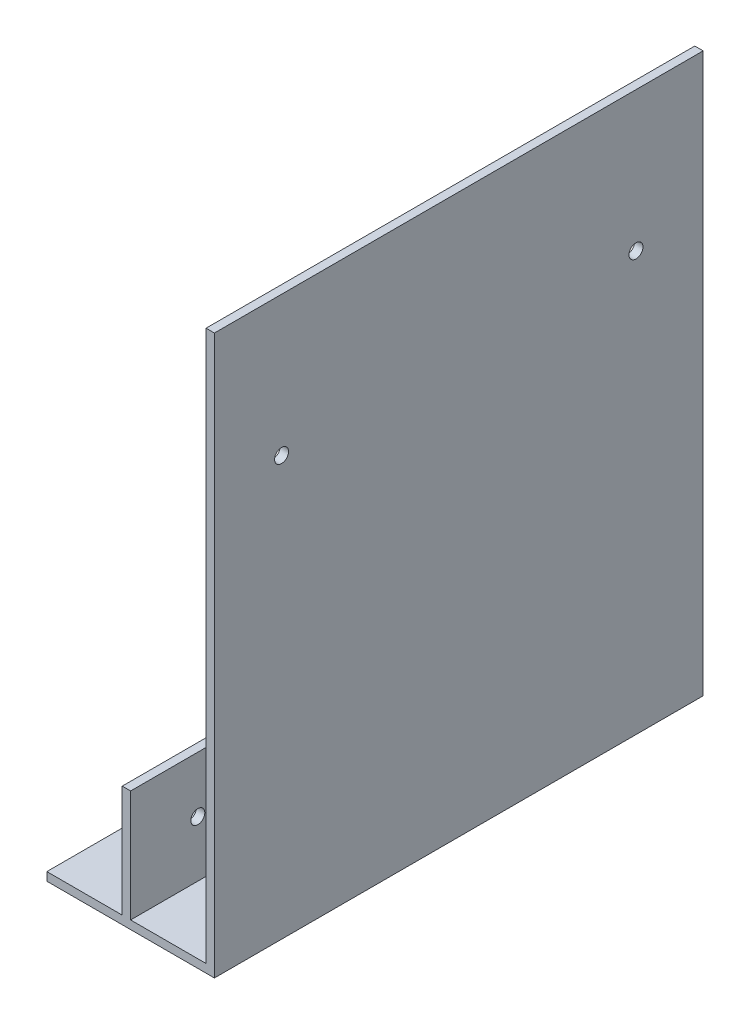
ISO-10303-21;
HEADER;
FILE_DESCRIPTION(('STEP AP214'),'2;1');
FILE_NAME('part.step','',(''),(''),'','','');
FILE_SCHEMA(('AUTOMOTIVE_DESIGN { 1 0 10303 214 1 1 1 1 }'));
ENDSEC;
DATA;
#1=APPLICATION_CONTEXT('core data for automotive mechanical design processes');
#2=APPLICATION_PROTOCOL_DEFINITION('international standard','automotive_design',2000,#1);
#3=PRODUCT_CONTEXT('',#1,'mechanical');
#4=PRODUCT('Part','Part','',(#3));
#5=PRODUCT_RELATED_PRODUCT_CATEGORY('part','',(#4));
#6=PRODUCT_DEFINITION_FORMATION('','',#4);
#7=PRODUCT_DEFINITION_CONTEXT('part definition',#1,'design');
#8=PRODUCT_DEFINITION('design','',#6,#7);
#9=PRODUCT_DEFINITION_SHAPE('','',#8);
#10=(LENGTH_UNIT() NAMED_UNIT(*) SI_UNIT(.MILLI.,.METRE.));
#11=(NAMED_UNIT(*) PLANE_ANGLE_UNIT() SI_UNIT($,.RADIAN.));
#12=(NAMED_UNIT(*) SI_UNIT($,.STERADIAN.) SOLID_ANGLE_UNIT());
#13=UNCERTAINTY_MEASURE_WITH_UNIT(LENGTH_MEASURE(1.E-05),#10,'distance_accuracy_value','');
#14=(GEOMETRIC_REPRESENTATION_CONTEXT(3) GLOBAL_UNCERTAINTY_ASSIGNED_CONTEXT((#13)) GLOBAL_UNIT_ASSIGNED_CONTEXT((#10,
#11,#12)) REPRESENTATION_CONTEXT('',''));
#15=CARTESIAN_POINT('',(0.,0.,0.));
#16=DIRECTION('',(0.,0.,1.));
#17=DIRECTION('',(1.,0.,0.));
#18=AXIS2_PLACEMENT_3D('',#15,#16,#17);
#19=CARTESIAN_POINT('',(3.,58.9769845057487,350.));
#20=DIRECTION('',(0.,-1.,0.));
#21=DIRECTION('',(0.,0.,-1.));
#22=AXIS2_PLACEMENT_3D('',#19,#20,#21);
#23=PLANE('',#22);
#24=DIRECTION('',(-1.,0.,0.));
#25=VECTOR('',#24,1.);
#26=CARTESIAN_POINT('',(3.,58.9769845057487,0.));
#27=LINE('',#26,#25);
#28=CARTESIAN_POINT('',(3.,58.9769845057487,0.));
#29=VERTEX_POINT('',#28);
#30=CARTESIAN_POINT('',(-3.,58.9769845057487,0.));
#31=VERTEX_POINT('',#30);
#32=EDGE_CURVE('E145',#29,#31,#27,.T.);
#33=ORIENTED_EDGE('',*,*,#32,.T.);
#34=DIRECTION('',(0.,0.,-1.));
#35=VECTOR('',#34,1.);
#36=CARTESIAN_POINT('',(-3.,58.9769845057487,350.));
#37=LINE('',#36,#35);
#38=CARTESIAN_POINT('',(-3.,58.9769845057487,350.));
#39=VERTEX_POINT('',#38);
#40=EDGE_CURVE('E11',#39,#31,#37,.T.);
#41=ORIENTED_EDGE('',*,*,#40,.F.);
#42=DIRECTION('',(-1.,0.,0.));
#43=VECTOR('',#42,1.);
#44=CARTESIAN_POINT('',(3.,58.9769845057487,350.));
#45=LINE('',#44,#43);
#46=CARTESIAN_POINT('',(3.,58.9769845057487,350.));
#47=VERTEX_POINT('',#46);
#48=EDGE_CURVE('E165',#47,#39,#45,.T.);
#49=ORIENTED_EDGE('',*,*,#48,.F.);
#50=DIRECTION('',(0.,0.,-1.));
#51=VECTOR('',#50,1.);
#52=CARTESIAN_POINT('',(3.,58.9769845057487,350.));
#53=LINE('',#52,#51);
#54=EDGE_CURVE('E141',#47,#29,#53,.T.);
#55=ORIENTED_EDGE('',*,*,#54,.T.);
#56=EDGE_LOOP('',(#33,#41,#49,#55));
#57=FACE_BOUND('',#56,.T.);
#58=ADVANCED_FACE('F35',(#57),#23,.F.);
#59=CARTESIAN_POINT('',(-3.,58.9769845057487,350.));
#60=DIRECTION('',(1.,0.,0.));
#61=DIRECTION('',(0.,1.,0.));
#62=AXIS2_PLACEMENT_3D('',#59,#60,#61);
#63=PLANE('',#62);
#64=CARTESIAN_POINT('',(-3.00000000000001,18.9769845057487,48.1041099646051));
#65=DIRECTION('',(1.,0.,0.));
#66=DIRECTION('',(0.,1.,0.));
#67=AXIS2_PLACEMENT_3D('',#64,#65,#66);
#68=CIRCLE('',#67,4.99999999999999);
#69=CARTESIAN_POINT('',(-3.00000000000001,23.9769845057487,48.1041099646051));
#70=VERTEX_POINT('',#69);
#71=EDGE_CURVE('E307',#70,#70,#68,.T.);
#72=ORIENTED_EDGE('',*,*,#71,.T.);
#73=EDGE_LOOP('',(#72));
#74=FACE_BOUND('',#73,.T.);
#75=CARTESIAN_POINT('',(-3.00000000000001,18.9769845057487,301.895890035395));
#76=DIRECTION('',(1.,0.,0.));
#77=DIRECTION('',(0.,1.,0.));
#78=AXIS2_PLACEMENT_3D('',#75,#76,#77);
#79=CIRCLE('',#78,4.99999999999999);
#80=CARTESIAN_POINT('',(-3.00000000000001,23.9769845057487,301.895890035395));
#81=VERTEX_POINT('',#80);
#82=EDGE_CURVE('E304',#81,#81,#79,.T.);
#83=ORIENTED_EDGE('',*,*,#82,.T.);
#84=EDGE_LOOP('',(#83));
#85=FACE_BOUND('',#84,.T.);
#86=CARTESIAN_POINT('',(-3.00000000000001,18.9769845057487,175.));
#87=DIRECTION('',(1.,0.,0.));
#88=DIRECTION('',(0.,1.,0.));
#89=AXIS2_PLACEMENT_3D('',#86,#87,#88);
#90=CIRCLE('',#89,11.);
#91=CARTESIAN_POINT('',(-3.00000000000001,29.9769845057487,175.));
#92=VERTEX_POINT('',#91);
#93=EDGE_CURVE('E301',#92,#92,#90,.T.);
#94=ORIENTED_EDGE('',*,*,#93,.T.);
#95=EDGE_LOOP('',(#94));
#96=FACE_BOUND('',#95,.T.);
#97=DIRECTION('',(0.,-1.,0.));
#98=VECTOR('',#97,1.);
#99=CARTESIAN_POINT('',(-3.,58.9769845057487,0.));
#100=LINE('',#99,#98);
#101=CARTESIAN_POINT('',(-3.00000000000001,-21.0230154942513,0.));
#102=VERTEX_POINT('',#101);
#103=EDGE_CURVE('E148',#31,#102,#100,.T.);
#104=ORIENTED_EDGE('',*,*,#103,.T.);
#105=DIRECTION('',(0.,0.,-1.));
#106=VECTOR('',#105,1.);
#107=CARTESIAN_POINT('',(-3.00000000000001,-21.0230154942513,350.));
#108=LINE('',#107,#106);
#109=CARTESIAN_POINT('',(-3.00000000000001,-21.0230154942513,350.));
#110=VERTEX_POINT('',#109);
#111=EDGE_CURVE('E44',#110,#102,#108,.T.);
#112=ORIENTED_EDGE('',*,*,#111,.F.);
#113=DIRECTION('',(0.,-1.,0.));
#114=VECTOR('',#113,1.);
#115=CARTESIAN_POINT('',(-3.,58.9769845057487,350.));
#116=LINE('',#115,#114);
#117=EDGE_CURVE('E102',#39,#110,#116,.T.);
#118=ORIENTED_EDGE('',*,*,#117,.F.);
#119=ORIENTED_EDGE('',*,*,#40,.T.);
#120=EDGE_LOOP('',(#104,#112,#118,#119));
#121=FACE_BOUND('',#120,.T.);
#122=ADVANCED_FACE('F246',(#74,#85,#96,#121),#63,.F.);
#123=CARTESIAN_POINT('',(-3.00000000000001,-21.0230154942513,350.));
#124=DIRECTION('',(0.,-1.,0.));
#125=DIRECTION('',(1.,0.,0.));
#126=AXIS2_PLACEMENT_3D('',#123,#124,#125);
#127=PLANE('',#126);
#128=CARTESIAN_POINT('',(-30.,-21.0230154942513,200.));
#129=DIRECTION('',(0.,-1.,0.));
#130=DIRECTION('',(1.,0.,0.));
#131=AXIS2_PLACEMENT_3D('',#128,#129,#130);
#132=CIRCLE('',#131,3.);
#133=CARTESIAN_POINT('',(-27.,-21.0230154942513,200.));
#134=VERTEX_POINT('',#133);
#135=EDGE_CURVE('E149',#134,#134,#132,.F.);
#136=ORIENTED_EDGE('',*,*,#135,.F.);
#137=EDGE_LOOP('',(#136));
#138=FACE_BOUND('',#137,.T.);
#139=CARTESIAN_POINT('',(-30.,-21.0230154942513,150.));
#140=DIRECTION('',(0.,-1.,0.));
#141=DIRECTION('',(1.,0.,0.));
#142=AXIS2_PLACEMENT_3D('',#139,#140,#141);
#143=CIRCLE('',#142,3.);
#144=CARTESIAN_POINT('',(-27.,-21.0230154942513,150.));
#145=VERTEX_POINT('',#144);
#146=EDGE_CURVE('E188',#145,#145,#143,.F.);
#147=ORIENTED_EDGE('',*,*,#146,.F.);
#148=EDGE_LOOP('',(#147));
#149=FACE_BOUND('',#148,.T.);
#150=DIRECTION('',(-1.,0.,0.));
#151=VECTOR('',#150,1.);
#152=CARTESIAN_POINT('',(-3.00000000000001,-21.0230154942513,0.));
#153=LINE('',#152,#151);
#154=CARTESIAN_POINT('',(-57.,-21.0230154942513,0.));
#155=VERTEX_POINT('',#154);
#156=EDGE_CURVE('E151',#102,#155,#153,.T.);
#157=ORIENTED_EDGE('',*,*,#156,.T.);
#158=DIRECTION('',(0.,0.,-1.));
#159=VECTOR('',#158,1.);
#160=CARTESIAN_POINT('',(-57.,-21.0230154942513,350.));
#161=LINE('',#160,#159);
#162=CARTESIAN_POINT('',(-57.,-21.0230154942513,350.));
#163=VERTEX_POINT('',#162);
#164=EDGE_CURVE('E178',#163,#155,#161,.T.);
#165=ORIENTED_EDGE('',*,*,#164,.F.);
#166=DIRECTION('',(-1.,0.,0.));
#167=VECTOR('',#166,1.);
#168=CARTESIAN_POINT('',(-3.00000000000001,-21.0230154942513,350.));
#169=LINE('',#168,#167);
#170=EDGE_CURVE('E207',#110,#163,#169,.T.);
#171=ORIENTED_EDGE('',*,*,#170,.F.);
#172=ORIENTED_EDGE('',*,*,#111,.T.);
#173=EDGE_LOOP('',(#157,#165,#171,#172));
#174=FACE_BOUND('',#173,.T.);
#175=ADVANCED_FACE('F250',(#138,#149,#174),#127,.F.);
#176=CARTESIAN_POINT('',(-57.,-21.0230154942513,350.));
#177=DIRECTION('',(1.,0.,0.));
#178=DIRECTION('',(0.,1.,0.));
#179=AXIS2_PLACEMENT_3D('',#176,#177,#178);
#180=PLANE('',#179);
#181=DIRECTION('',(0.,-1.,0.));
#182=VECTOR('',#181,1.);
#183=CARTESIAN_POINT('',(-57.,-21.0230154942513,0.));
#184=LINE('',#183,#182);
#185=CARTESIAN_POINT('',(-57.,-27.0230154942513,0.));
#186=VERTEX_POINT('',#185);
#187=EDGE_CURVE('E153',#155,#186,#184,.T.);
#188=ORIENTED_EDGE('',*,*,#187,.T.);
#189=DIRECTION('',(0.,0.,-1.));
#190=VECTOR('',#189,1.);
#191=CARTESIAN_POINT('',(-57.,-27.0230154942513,350.));
#192=LINE('',#191,#190);
#193=CARTESIAN_POINT('',(-57.,-27.0230154942513,350.));
#194=VERTEX_POINT('',#193);
#195=EDGE_CURVE('E175',#194,#186,#192,.T.);
#196=ORIENTED_EDGE('',*,*,#195,.F.);
#197=DIRECTION('',(0.,-1.,0.));
#198=VECTOR('',#197,1.);
#199=CARTESIAN_POINT('',(-57.,-21.0230154942513,350.));
#200=LINE('',#199,#198);
#201=EDGE_CURVE('E209',#163,#194,#200,.T.);
#202=ORIENTED_EDGE('',*,*,#201,.F.);
#203=ORIENTED_EDGE('',*,*,#164,.T.);
#204=EDGE_LOOP('',(#188,#196,#202,#203));
#205=FACE_BOUND('',#204,.T.);
#206=ADVANCED_FACE('F255',(#205),#180,.F.);
#207=CARTESIAN_POINT('',(57.,-27.0230154942513,350.));
#208=DIRECTION('',(0.,1.,0.));
#209=DIRECTION('',(0.,0.,1.));
#210=AXIS2_PLACEMENT_3D('',#207,#208,#209);
#211=PLANE('',#210);
#212=CARTESIAN_POINT('',(30.,-27.0230154942513,150.));
#213=DIRECTION('',(0.,1.,0.));
#214=DIRECTION('',(0.,0.,-1.));
#215=AXIS2_PLACEMENT_3D('',#212,#213,#214);
#216=CIRCLE('',#215,3.);
#217=CARTESIAN_POINT('',(30.,-27.0230154942513,147.));
#218=VERTEX_POINT('',#217);
#219=EDGE_CURVE('E199',#218,#218,#216,.T.);
#220=ORIENTED_EDGE('',*,*,#219,.T.);
#221=EDGE_LOOP('',(#220));
#222=FACE_BOUND('',#221,.T.);
#223=CARTESIAN_POINT('',(30.,-27.0230154942513,200.));
#224=DIRECTION('',(0.,1.,0.));
#225=DIRECTION('',(0.,0.,1.));
#226=AXIS2_PLACEMENT_3D('',#223,#224,#225);
#227=CIRCLE('',#226,3.);
#228=CARTESIAN_POINT('',(30.,-27.0230154942513,203.));
#229=VERTEX_POINT('',#228);
#230=EDGE_CURVE('E195',#229,#229,#227,.T.);
#231=ORIENTED_EDGE('',*,*,#230,.T.);
#232=EDGE_LOOP('',(#231));
#233=FACE_BOUND('',#232,.T.);
#234=CARTESIAN_POINT('',(-30.,-27.0230154942513,200.));
#235=DIRECTION('',(0.,1.,0.));
#236=DIRECTION('',(0.,0.,-1.));
#237=AXIS2_PLACEMENT_3D('',#234,#235,#236);
#238=CIRCLE('',#237,3.);
#239=CARTESIAN_POINT('',(-30.,-27.0230154942513,197.));
#240=VERTEX_POINT('',#239);
#241=EDGE_CURVE('E190',#240,#240,#238,.T.);
#242=ORIENTED_EDGE('',*,*,#241,.T.);
#243=EDGE_LOOP('',(#242));
#244=FACE_BOUND('',#243,.T.);
#245=CARTESIAN_POINT('',(-30.,-27.0230154942513,150.));
#246=DIRECTION('',(0.,1.,0.));
#247=DIRECTION('',(0.,0.,1.));
#248=AXIS2_PLACEMENT_3D('',#245,#246,#247);
#249=CIRCLE('',#248,3.);
#250=CARTESIAN_POINT('',(-30.,-27.0230154942513,153.));
#251=VERTEX_POINT('',#250);
#252=EDGE_CURVE('E184',#251,#251,#249,.T.);
#253=ORIENTED_EDGE('',*,*,#252,.T.);
#254=EDGE_LOOP('',(#253));
#255=FACE_BOUND('',#254,.T.);
#256=DIRECTION('',(1.,0.,0.));
#257=VECTOR('',#256,1.);
#258=CARTESIAN_POINT('',(57.,-27.0230154942513,0.));
#259=LINE('',#258,#257);
#260=CARTESIAN_POINT('',(63.,-27.0230154942513,0.));
#261=VERTEX_POINT('',#260);
#262=EDGE_CURVE('E156',#186,#261,#259,.T.);
#263=ORIENTED_EDGE('',*,*,#262,.T.);
#264=DIRECTION('',(0.,0.,-1.));
#265=VECTOR('',#264,1.);
#266=CARTESIAN_POINT('',(63.,-27.0230154942513,350.));
#267=LINE('',#266,#265);
#268=CARTESIAN_POINT('',(63.,-27.0230154942513,350.));
#269=VERTEX_POINT('',#268);
#270=EDGE_CURVE('E172',#269,#261,#267,.T.);
#271=ORIENTED_EDGE('',*,*,#270,.F.);
#272=DIRECTION('',(1.,0.,0.));
#273=VECTOR('',#272,1.);
#274=CARTESIAN_POINT('',(57.,-27.0230154942513,350.));
#275=LINE('',#274,#273);
#276=EDGE_CURVE('E211',#194,#269,#275,.T.);
#277=ORIENTED_EDGE('',*,*,#276,.F.);
#278=ORIENTED_EDGE('',*,*,#195,.T.);
#279=EDGE_LOOP('',(#263,#271,#277,#278));
#280=FACE_BOUND('',#279,.T.);
#281=ADVANCED_FACE('F263',(#222,#233,#244,#255,#280),#211,.F.);
#282=CARTESIAN_POINT('',(63.,372.976984505749,350.));
#283=DIRECTION('',(-1.,0.,0.));
#284=DIRECTION('',(0.,-1.,0.));
#285=AXIS2_PLACEMENT_3D('',#282,#283,#284);
#286=PLANE('',#285);
#287=CARTESIAN_POINT('',(63.,272.976984505749,48.1));
#288=DIRECTION('',(-1.,0.,0.));
#289=DIRECTION('',(0.,0.,1.));
#290=AXIS2_PLACEMENT_3D('',#287,#288,#289);
#291=CIRCLE('',#290,5.00000000000001);
#292=CARTESIAN_POINT('',(63.,272.976984505749,53.1));
#293=VERTEX_POINT('',#292);
#294=EDGE_CURVE('E298',#293,#293,#291,.T.);
#295=ORIENTED_EDGE('',*,*,#294,.T.);
#296=EDGE_LOOP('',(#295));
#297=FACE_BOUND('',#296,.T.);
#298=CARTESIAN_POINT('',(63.,272.976984505749,301.9));
#299=DIRECTION('',(-1.,0.,0.));
#300=DIRECTION('',(0.,0.,-1.));
#301=AXIS2_PLACEMENT_3D('',#298,#299,#300);
#302=CIRCLE('',#301,4.99999999999999);
#303=CARTESIAN_POINT('',(63.,272.976984505749,296.9));
#304=VERTEX_POINT('',#303);
#305=EDGE_CURVE('E285',#304,#304,#302,.T.);
#306=ORIENTED_EDGE('',*,*,#305,.T.);
#307=EDGE_LOOP('',(#306));
#308=FACE_BOUND('',#307,.T.);
#309=DIRECTION('',(0.,1.,0.));
#310=VECTOR('',#309,1.);
#311=CARTESIAN_POINT('',(63.,372.976984505749,0.));
#312=LINE('',#311,#310);
#313=CARTESIAN_POINT('',(63.,372.976984505749,0.));
#314=VERTEX_POINT('',#313);
#315=EDGE_CURVE('E158',#261,#314,#312,.T.);
#316=ORIENTED_EDGE('',*,*,#315,.T.);
#317=DIRECTION('',(0.,0.,-1.));
#318=VECTOR('',#317,1.);
#319=CARTESIAN_POINT('',(63.,372.976984505749,350.));
#320=LINE('',#319,#318);
#321=CARTESIAN_POINT('',(63.,372.976984505749,350.));
#322=VERTEX_POINT('',#321);
#323=EDGE_CURVE('E169',#322,#314,#320,.T.);
#324=ORIENTED_EDGE('',*,*,#323,.F.);
#325=DIRECTION('',(0.,1.,0.));
#326=VECTOR('',#325,1.);
#327=CARTESIAN_POINT('',(63.,372.976984505749,350.));
#328=LINE('',#327,#326);
#329=EDGE_CURVE('E213',#269,#322,#328,.T.);
#330=ORIENTED_EDGE('',*,*,#329,.F.);
#331=ORIENTED_EDGE('',*,*,#270,.T.);
#332=EDGE_LOOP('',(#316,#324,#330,#331));
#333=FACE_BOUND('',#332,.T.);
#334=ADVANCED_FACE('F219',(#297,#308,#333),#286,.F.);
#335=CARTESIAN_POINT('',(57.,372.976984505749,350.));
#336=DIRECTION('',(0.,-1.,0.));
#337=DIRECTION('',(1.,0.,0.));
#338=AXIS2_PLACEMENT_3D('',#335,#336,#337);
#339=PLANE('',#338);
#340=DIRECTION('',(-1.,0.,0.));
#341=VECTOR('',#340,1.);
#342=CARTESIAN_POINT('',(57.,372.976984505749,0.));
#343=LINE('',#342,#341);
#344=CARTESIAN_POINT('',(57.,372.976984505749,0.));
#345=VERTEX_POINT('',#344);
#346=EDGE_CURVE('E160',#314,#345,#343,.T.);
#347=ORIENTED_EDGE('',*,*,#346,.T.);
#348=DIRECTION('',(0.,0.,-1.));
#349=VECTOR('',#348,1.);
#350=CARTESIAN_POINT('',(57.,372.976984505749,350.));
#351=LINE('',#350,#349);
#352=CARTESIAN_POINT('',(57.,372.976984505749,350.));
#353=VERTEX_POINT('',#352);
#354=EDGE_CURVE('E136',#353,#345,#351,.T.);
#355=ORIENTED_EDGE('',*,*,#354,.F.);
#356=DIRECTION('',(-1.,0.,0.));
#357=VECTOR('',#356,1.);
#358=CARTESIAN_POINT('',(57.,372.976984505749,350.));
#359=LINE('',#358,#357);
#360=EDGE_CURVE('E127',#322,#353,#359,.T.);
#361=ORIENTED_EDGE('',*,*,#360,.F.);
#362=ORIENTED_EDGE('',*,*,#323,.T.);
#363=EDGE_LOOP('',(#347,#355,#361,#362));
#364=FACE_BOUND('',#363,.T.);
#365=ADVANCED_FACE('F223',(#364),#339,.F.);
#366=CARTESIAN_POINT('',(57.,-21.0230154942513,350.));
#367=DIRECTION('',(1.,0.,0.));
#368=DIRECTION('',(0.,0.,-1.));
#369=AXIS2_PLACEMENT_3D('',#366,#367,#368);
#370=PLANE('',#369);
#371=CARTESIAN_POINT('',(57.,272.976984505749,48.1));
#372=DIRECTION('',(-1.,0.,0.));
#373=DIRECTION('',(0.,0.,1.));
#374=AXIS2_PLACEMENT_3D('',#371,#372,#373);
#375=CIRCLE('',#374,5.00000000000001);
#376=CARTESIAN_POINT('',(57.,272.976984505749,53.1));
#377=VERTEX_POINT('',#376);
#378=EDGE_CURVE('E280',#377,#377,#375,.T.);
#379=ORIENTED_EDGE('',*,*,#378,.F.);
#380=EDGE_LOOP('',(#379));
#381=FACE_BOUND('',#380,.T.);
#382=CARTESIAN_POINT('',(57.,272.976984505749,301.9));
#383=DIRECTION('',(-1.,0.,0.));
#384=DIRECTION('',(0.,0.,-1.));
#385=AXIS2_PLACEMENT_3D('',#382,#383,#384);
#386=CIRCLE('',#385,4.99999999999999);
#387=CARTESIAN_POINT('',(57.,272.976984505749,296.9));
#388=VERTEX_POINT('',#387);
#389=EDGE_CURVE('E283',#388,#388,#386,.T.);
#390=ORIENTED_EDGE('',*,*,#389,.F.);
#391=EDGE_LOOP('',(#390));
#392=FACE_BOUND('',#391,.T.);
#393=DIRECTION('',(0.,-1.,0.));
#394=VECTOR('',#393,1.);
#395=CARTESIAN_POINT('',(57.,-21.0230154942513,0.));
#396=LINE('',#395,#394);
#397=CARTESIAN_POINT('',(57.,-21.0230154942513,0.));
#398=VERTEX_POINT('',#397);
#399=EDGE_CURVE('E135',#345,#398,#396,.T.);
#400=ORIENTED_EDGE('',*,*,#399,.T.);
#401=DIRECTION('',(0.,0.,-1.));
#402=VECTOR('',#401,1.);
#403=CARTESIAN_POINT('',(57.,-21.0230154942513,350.));
#404=LINE('',#403,#402);
#405=CARTESIAN_POINT('',(57.,-21.0230154942513,350.));
#406=VERTEX_POINT('',#405);
#407=EDGE_CURVE('E132',#406,#398,#404,.T.);
#408=ORIENTED_EDGE('',*,*,#407,.F.);
#409=DIRECTION('',(0.,-1.,0.));
#410=VECTOR('',#409,1.);
#411=CARTESIAN_POINT('',(57.,-21.0230154942513,350.));
#412=LINE('',#411,#410);
#413=EDGE_CURVE('E121',#353,#406,#412,.T.);
#414=ORIENTED_EDGE('',*,*,#413,.F.);
#415=ORIENTED_EDGE('',*,*,#354,.T.);
#416=EDGE_LOOP('',(#400,#408,#414,#415));
#417=FACE_BOUND('',#416,.T.);
#418=ADVANCED_FACE('F133',(#381,#392,#417),#370,.F.);
#419=CARTESIAN_POINT('',(3.00000000000001,-21.0230154942513,350.));
#420=DIRECTION('',(0.,-1.,0.));
#421=DIRECTION('',(0.,0.,-1.));
#422=AXIS2_PLACEMENT_3D('',#419,#420,#421);
#423=PLANE('',#422);
#424=CARTESIAN_POINT('',(30.,-21.0230154942513,150.));
#425=DIRECTION('',(0.,-1.,0.));
#426=DIRECTION('',(0.,0.,-1.));
#427=AXIS2_PLACEMENT_3D('',#424,#425,#426);
#428=CIRCLE('',#427,3.);
#429=CARTESIAN_POINT('',(30.,-21.0230154942513,147.));
#430=VERTEX_POINT('',#429);
#431=EDGE_CURVE('E38',#430,#430,#428,.F.);
#432=ORIENTED_EDGE('',*,*,#431,.F.);
#433=EDGE_LOOP('',(#432));
#434=FACE_BOUND('',#433,.T.);
#435=CARTESIAN_POINT('',(30.,-21.0230154942513,200.));
#436=DIRECTION('',(0.,-1.,0.));
#437=DIRECTION('',(0.,0.,-1.));
#438=AXIS2_PLACEMENT_3D('',#435,#436,#437);
#439=CIRCLE('',#438,3.);
#440=CARTESIAN_POINT('',(30.,-21.0230154942513,197.));
#441=VERTEX_POINT('',#440);
#442=EDGE_CURVE('E182',#441,#441,#439,.F.);
#443=ORIENTED_EDGE('',*,*,#442,.F.);
#444=EDGE_LOOP('',(#443));
#445=FACE_BOUND('',#444,.T.);
#446=DIRECTION('',(-1.,0.,0.));
#447=VECTOR('',#446,1.);
#448=CARTESIAN_POINT('',(3.00000000000001,-21.0230154942513,0.));
#449=LINE('',#448,#447);
#450=CARTESIAN_POINT('',(3.00000000000001,-21.0230154942513,0.));
#451=VERTEX_POINT('',#450);
#452=EDGE_CURVE('E88',#398,#451,#449,.T.);
#453=ORIENTED_EDGE('',*,*,#452,.T.);
#454=DIRECTION('',(0.,0.,-1.));
#455=VECTOR('',#454,1.);
#456=CARTESIAN_POINT('',(3.00000000000001,-21.0230154942513,350.));
#457=LINE('',#456,#455);
#458=CARTESIAN_POINT('',(3.00000000000001,-21.0230154942513,350.));
#459=VERTEX_POINT('',#458);
#460=EDGE_CURVE('E137',#459,#451,#457,.T.);
#461=ORIENTED_EDGE('',*,*,#460,.F.);
#462=DIRECTION('',(-1.,0.,0.));
#463=VECTOR('',#462,1.);
#464=CARTESIAN_POINT('',(3.00000000000001,-21.0230154942513,350.));
#465=LINE('',#464,#463);
#466=EDGE_CURVE('E125',#406,#459,#465,.T.);
#467=ORIENTED_EDGE('',*,*,#466,.F.);
#468=ORIENTED_EDGE('',*,*,#407,.T.);
#469=EDGE_LOOP('',(#453,#461,#467,#468));
#470=FACE_BOUND('',#469,.T.);
#471=ADVANCED_FACE('F139',(#434,#445,#470),#423,.F.);
#472=CARTESIAN_POINT('',(3.,58.9769845057487,350.));
#473=DIRECTION('',(-1.,0.,0.));
#474=DIRECTION('',(0.,-1.,0.));
#475=AXIS2_PLACEMENT_3D('',#472,#473,#474);
#476=PLANE('',#475);
#477=CARTESIAN_POINT('',(3.00000000000001,18.9769845057487,48.1041099646051));
#478=DIRECTION('',(1.,0.,0.));
#479=DIRECTION('',(0.,-1.,0.));
#480=AXIS2_PLACEMENT_3D('',#477,#478,#479);
#481=CIRCLE('',#480,4.99999999999999);
#482=CARTESIAN_POINT('',(3.00000000000001,23.9769845057487,48.1041099646051));
#483=VERTEX_POINT('',#482);
#484=EDGE_CURVE('E295',#483,#483,#481,.T.);
#485=ORIENTED_EDGE('',*,*,#484,.F.);
#486=EDGE_LOOP('',(#485));
#487=FACE_BOUND('',#486,.T.);
#488=CARTESIAN_POINT('',(3.00000000000001,18.9769845057487,301.895890035395));
#489=DIRECTION('',(1.,0.,0.));
#490=DIRECTION('',(0.,1.,0.));
#491=AXIS2_PLACEMENT_3D('',#488,#489,#490);
#492=CIRCLE('',#491,4.99999999999999);
#493=CARTESIAN_POINT('',(3.00000000000001,23.9769845057487,301.895890035395));
#494=VERTEX_POINT('',#493);
#495=EDGE_CURVE('E291',#494,#494,#492,.T.);
#496=ORIENTED_EDGE('',*,*,#495,.F.);
#497=EDGE_LOOP('',(#496));
#498=FACE_BOUND('',#497,.T.);
#499=CARTESIAN_POINT('',(3.00000000000001,18.9769845057487,175.));
#500=DIRECTION('',(1.,0.,0.));
#501=DIRECTION('',(0.,1.,0.));
#502=AXIS2_PLACEMENT_3D('',#499,#500,#501);
#503=CIRCLE('',#502,11.);
#504=CARTESIAN_POINT('',(3.00000000000001,29.9769845057487,175.));
#505=VERTEX_POINT('',#504);
#506=EDGE_CURVE('E294',#505,#505,#503,.T.);
#507=ORIENTED_EDGE('',*,*,#506,.F.);
#508=EDGE_LOOP('',(#507));
#509=FACE_BOUND('',#508,.T.);
#510=DIRECTION('',(0.,1.,0.));
#511=VECTOR('',#510,1.);
#512=CARTESIAN_POINT('',(3.,58.9769845057487,0.));
#513=LINE('',#512,#511);
#514=EDGE_CURVE('E94',#451,#29,#513,.T.);
#515=ORIENTED_EDGE('',*,*,#514,.T.);
#516=ORIENTED_EDGE('',*,*,#54,.F.);
#517=DIRECTION('',(0.,1.,0.));
#518=VECTOR('',#517,1.);
#519=CARTESIAN_POINT('',(3.,58.9769845057487,350.));
#520=LINE('',#519,#518);
#521=EDGE_CURVE('E53',#459,#47,#520,.T.);
#522=ORIENTED_EDGE('',*,*,#521,.F.);
#523=ORIENTED_EDGE('',*,*,#460,.T.);
#524=EDGE_LOOP('',(#515,#516,#522,#523));
#525=FACE_BOUND('',#524,.T.);
#526=ADVANCED_FACE('F231',(#487,#498,#509,#525),#476,.F.);
#527=CARTESIAN_POINT('',(0.,0.,350.));
#528=DIRECTION('',(0.,0.,1.));
#529=DIRECTION('',(1.,0.,0.));
#530=AXIS2_PLACEMENT_3D('',#527,#528,#529);
#531=PLANE('',#530);
#532=ORIENTED_EDGE('',*,*,#48,.T.);
#533=ORIENTED_EDGE('',*,*,#117,.T.);
#534=ORIENTED_EDGE('',*,*,#170,.T.);
#535=ORIENTED_EDGE('',*,*,#201,.T.);
#536=ORIENTED_EDGE('',*,*,#276,.T.);
#537=ORIENTED_EDGE('',*,*,#329,.T.);
#538=ORIENTED_EDGE('',*,*,#360,.T.);
#539=ORIENTED_EDGE('',*,*,#413,.T.);
#540=ORIENTED_EDGE('',*,*,#466,.T.);
#541=ORIENTED_EDGE('',*,*,#521,.T.);
#542=EDGE_LOOP('',(#532,#533,#534,#535,#536,#537,#538,#539,#540,#541));
#543=FACE_BOUND('',#542,.T.);
#544=ADVANCED_FACE('F123',(#543),#531,.T.);
#545=CARTESIAN_POINT('',(0.,0.,0.));
#546=DIRECTION('',(0.,0.,1.));
#547=DIRECTION('',(1.,0.,0.));
#548=AXIS2_PLACEMENT_3D('',#545,#546,#547);
#549=PLANE('',#548);
#550=ORIENTED_EDGE('',*,*,#32,.F.);
#551=ORIENTED_EDGE('',*,*,#514,.F.);
#552=ORIENTED_EDGE('',*,*,#452,.F.);
#553=ORIENTED_EDGE('',*,*,#399,.F.);
#554=ORIENTED_EDGE('',*,*,#346,.F.);
#555=ORIENTED_EDGE('',*,*,#315,.F.);
#556=ORIENTED_EDGE('',*,*,#262,.F.);
#557=ORIENTED_EDGE('',*,*,#187,.F.);
#558=ORIENTED_EDGE('',*,*,#156,.F.);
#559=ORIENTED_EDGE('',*,*,#103,.F.);
#560=EDGE_LOOP('',(#550,#551,#552,#553,#554,#555,#556,#557,#558,#559));
#561=FACE_BOUND('',#560,.T.);
#562=ADVANCED_FACE('F226',(#561),#549,.F.);
#563=CARTESIAN_POINT('',(30.,372.976984505749,200.));
#564=DIRECTION('',(0.,-1.,0.));
#565=DIRECTION('',(0.,0.,-1.));
#566=AXIS2_PLACEMENT_3D('',#563,#564,#565);
#567=CYLINDRICAL_SURFACE('',#566,3.);
#568=ORIENTED_EDGE('',*,*,#230,.F.);
#569=EDGE_LOOP('',(#568));
#570=FACE_BOUND('',#569,.T.);
#571=ORIENTED_EDGE('',*,*,#442,.T.);
#572=EDGE_LOOP('',(#571));
#573=FACE_BOUND('',#572,.T.);
#574=ADVANCED_FACE('F318',(#570,#573),#567,.F.);
#575=CARTESIAN_POINT('',(30.,372.976984505749,150.));
#576=DIRECTION('',(0.,-1.,0.));
#577=DIRECTION('',(0.,0.,-1.));
#578=AXIS2_PLACEMENT_3D('',#575,#576,#577);
#579=CYLINDRICAL_SURFACE('',#578,3.);
#580=ORIENTED_EDGE('',*,*,#219,.F.);
#581=EDGE_LOOP('',(#580));
#582=FACE_BOUND('',#581,.T.);
#583=ORIENTED_EDGE('',*,*,#431,.T.);
#584=EDGE_LOOP('',(#583));
#585=FACE_BOUND('',#584,.T.);
#586=ADVANCED_FACE('F314',(#582,#585),#579,.F.);
#587=CARTESIAN_POINT('',(-30.,372.976984505749,150.));
#588=DIRECTION('',(0.,-1.,0.));
#589=DIRECTION('',(0.,0.,-1.));
#590=AXIS2_PLACEMENT_3D('',#587,#588,#589);
#591=CYLINDRICAL_SURFACE('',#590,3.);
#592=ORIENTED_EDGE('',*,*,#252,.F.);
#593=EDGE_LOOP('',(#592));
#594=FACE_BOUND('',#593,.T.);
#595=ORIENTED_EDGE('',*,*,#146,.T.);
#596=EDGE_LOOP('',(#595));
#597=FACE_BOUND('',#596,.T.);
#598=ADVANCED_FACE('F317',(#594,#597),#591,.F.);
#599=CARTESIAN_POINT('',(-30.,372.976984505749,200.));
#600=DIRECTION('',(0.,-1.,0.));
#601=DIRECTION('',(0.,0.,-1.));
#602=AXIS2_PLACEMENT_3D('',#599,#600,#601);
#603=CYLINDRICAL_SURFACE('',#602,3.);
#604=ORIENTED_EDGE('',*,*,#241,.F.);
#605=EDGE_LOOP('',(#604));
#606=FACE_BOUND('',#605,.T.);
#607=ORIENTED_EDGE('',*,*,#135,.T.);
#608=EDGE_LOOP('',(#607));
#609=FACE_BOUND('',#608,.T.);
#610=ADVANCED_FACE('F326',(#606,#609),#603,.F.);
#611=CARTESIAN_POINT('',(-57.,18.9769845057487,175.));
#612=DIRECTION('',(1.,0.,0.));
#613=DIRECTION('',(0.,1.,0.));
#614=AXIS2_PLACEMENT_3D('',#611,#612,#613);
#615=CYLINDRICAL_SURFACE('',#614,11.);
#616=CARTESIAN_POINT('',(3.00000000000001,29.9769845057487,175.));
#617=CARTESIAN_POINT('',(2.93750000000001,29.9769845057487,175.));
#618=CARTESIAN_POINT('',(2.87500000000001,29.9769845057487,175.));
#619=CARTESIAN_POINT('',(2.75000000000001,29.9769845057487,175.));
#620=CARTESIAN_POINT('',(2.68750000000001,29.9769845057487,175.));
#621=CARTESIAN_POINT('',(2.56250000000001,29.9769845057487,175.));
#622=CARTESIAN_POINT('',(2.50000000000001,29.9769845057487,175.));
#623=CARTESIAN_POINT('',(2.37500000000001,29.9769845057487,175.));
#624=CARTESIAN_POINT('',(2.31250000000001,29.9769845057487,175.));
#625=CARTESIAN_POINT('',(2.18750000000001,29.9769845057487,175.));
#626=CARTESIAN_POINT('',(2.12500000000001,29.9769845057487,175.));
#627=CARTESIAN_POINT('',(2.00000000000001,29.9769845057487,175.));
#628=CARTESIAN_POINT('',(1.93750000000001,29.9769845057487,175.));
#629=CARTESIAN_POINT('',(1.81250000000001,29.9769845057487,175.));
#630=CARTESIAN_POINT('',(1.75000000000001,29.9769845057487,175.));
#631=CARTESIAN_POINT('',(1.62500000000001,29.9769845057487,175.));
#632=CARTESIAN_POINT('',(1.56250000000001,29.9769845057487,175.));
#633=CARTESIAN_POINT('',(1.43750000000001,29.9769845057487,175.));
#634=CARTESIAN_POINT('',(1.375,29.9769845057487,175.));
#635=CARTESIAN_POINT('',(1.25,29.9769845057487,175.));
#636=CARTESIAN_POINT('',(1.1875,29.9769845057487,175.));
#637=CARTESIAN_POINT('',(1.0625,29.9769845057487,175.));
#638=CARTESIAN_POINT('',(1.,29.9769845057487,175.));
#639=CARTESIAN_POINT('',(0.875000000000001,29.9769845057487,175.));
#640=CARTESIAN_POINT('',(0.812500000000001,29.9769845057487,175.));
#641=CARTESIAN_POINT('',(0.687500000000001,29.9769845057487,175.));
#642=CARTESIAN_POINT('',(0.625000000000001,29.9769845057487,175.));
#643=CARTESIAN_POINT('',(0.5,29.9769845057487,175.));
#644=CARTESIAN_POINT('',(0.4375,29.9769845057487,175.));
#645=CARTESIAN_POINT('',(0.3125,29.9769845057487,175.));
#646=CARTESIAN_POINT('',(0.25,29.9769845057487,175.));
#647=CARTESIAN_POINT('',(0.125,29.9769845057487,175.));
#648=CARTESIAN_POINT('',(0.0625,29.9769845057487,175.));
#649=CARTESIAN_POINT('',(-0.0625,29.9769845057487,175.));
#650=CARTESIAN_POINT('',(-0.125,29.9769845057487,175.));
#651=CARTESIAN_POINT('',(-0.25,29.9769845057487,175.));
#652=CARTESIAN_POINT('',(-0.3125,29.9769845057487,175.));
#653=CARTESIAN_POINT('',(-0.4375,29.9769845057487,175.));
#654=CARTESIAN_POINT('',(-0.5,29.9769845057487,175.));
#655=CARTESIAN_POINT('',(-0.625000000000001,29.9769845057487,175.));
#656=CARTESIAN_POINT('',(-0.687500000000001,29.9769845057487,175.));
#657=CARTESIAN_POINT('',(-0.812500000000001,29.9769845057487,175.));
#658=CARTESIAN_POINT('',(-0.875000000000001,29.9769845057487,175.));
#659=CARTESIAN_POINT('',(-1.,29.9769845057487,175.));
#660=CARTESIAN_POINT('',(-1.0625,29.9769845057487,175.));
#661=CARTESIAN_POINT('',(-1.1875,29.9769845057487,175.));
#662=CARTESIAN_POINT('',(-1.25,29.9769845057487,175.));
#663=CARTESIAN_POINT('',(-1.375,29.9769845057487,175.));
#664=CARTESIAN_POINT('',(-1.43750000000001,29.9769845057487,175.));
#665=CARTESIAN_POINT('',(-1.56250000000001,29.9769845057487,175.));
#666=CARTESIAN_POINT('',(-1.625,29.9769845057487,175.));
#667=CARTESIAN_POINT('',(-1.75,29.9769845057487,175.));
#668=CARTESIAN_POINT('',(-1.81250000000001,29.9769845057487,175.));
#669=CARTESIAN_POINT('',(-1.93750000000001,29.9769845057487,175.));
#670=CARTESIAN_POINT('',(-2.00000000000001,29.9769845057487,175.));
#671=CARTESIAN_POINT('',(-2.12500000000001,29.9769845057487,175.));
#672=CARTESIAN_POINT('',(-2.18750000000001,29.9769845057487,175.));
#673=CARTESIAN_POINT('',(-2.31250000000001,29.9769845057487,175.));
#674=CARTESIAN_POINT('',(-2.37500000000001,29.9769845057487,175.));
#675=CARTESIAN_POINT('',(-2.50000000000001,29.9769845057487,175.));
#676=CARTESIAN_POINT('',(-2.56250000000001,29.9769845057487,175.));
#677=CARTESIAN_POINT('',(-2.68750000000001,29.9769845057487,175.));
#678=CARTESIAN_POINT('',(-2.75000000000001,29.9769845057487,175.));
#679=CARTESIAN_POINT('',(-2.87500000000001,29.9769845057487,175.));
#680=CARTESIAN_POINT('',(-2.93750000000001,29.9769845057487,175.));
#681=CARTESIAN_POINT('',(-3.00000000000001,29.9769845057487,175.));
#682=B_SPLINE_CURVE_WITH_KNOTS('',3,(#616,#617,#618,#619,#620,#621,#622,#623,#624,#625,#626,
#627,#628,#629,#630,#631,#632,#633,#634,#635,#636,#637,#638,#639,#640,#641,#642,#643,#644,#645,
#646,#647,#648,#649,#650,#651,#652,#653,#654,#655,#656,#657,#658,#659,#660,#661,#662,#663,#664,
#665,#666,#667,#668,#669,#670,#671,#672,#673,#674,#675,#676,#677,#678,#679,#680,#681),
.UNSPECIFIED.,.F.,.F.,(4,2,2,2,2,2,2,2,2,2,2,2,2,2,2,2,2,2,2,2,2,2,2,2,2,2,2,2,2,2,2,2,4),(0.,
0.1875,0.375,0.5625,0.750000000000001,0.937500000000001,1.125,1.3125,1.5,1.68750000000001,
1.87500000000001,2.06250000000001,2.25000000000001,2.43750000000001,2.62500000000001,
2.81250000000001,3.00000000000001,3.18750000000001,3.37500000000001,3.56250000000001,
3.75000000000001,3.93750000000001,4.12500000000001,4.31250000000001,4.50000000000002,
4.68750000000001,4.87500000000002,5.06250000000002,5.25000000000002,5.43750000000002,
5.62500000000002,5.81250000000002,6.00000000000002),.UNSPECIFIED.);
#683=EDGE_CURVE('BSEAM364',#505,#92,#682,.T.);
#684=ORIENTED_EDGE('',*,*,#506,.T.);
#685=ORIENTED_EDGE('',*,*,#93,.F.);
#686=ORIENTED_EDGE('',*,*,#683,.T.);
#687=ORIENTED_EDGE('',*,*,#683,.F.);
#688=EDGE_LOOP('',(#684,#686,#685,#687));
#689=FACE_BOUND('',#688,.T.);
#690=ADVANCED_FACE('F364',(#689),#615,.F.);
#691=CARTESIAN_POINT('',(-57.,18.9769845057487,301.895890035395));
#692=DIRECTION('',(1.,0.,0.));
#693=DIRECTION('',(0.,1.,0.));
#694=AXIS2_PLACEMENT_3D('',#691,#692,#693);
#695=CYLINDRICAL_SURFACE('',#694,4.99999999999999);
#696=CARTESIAN_POINT('',(3.00000000000001,23.9769845057487,301.895890035395));
#697=CARTESIAN_POINT('',(2.93750000000001,23.9769845057487,301.895890035395));
#698=CARTESIAN_POINT('',(2.87500000000001,23.9769845057487,301.895890035395));
#699=CARTESIAN_POINT('',(2.75000000000001,23.9769845057487,301.895890035395));
#700=CARTESIAN_POINT('',(2.68750000000001,23.9769845057487,301.895890035395));
#701=CARTESIAN_POINT('',(2.56250000000001,23.9769845057487,301.895890035395));
#702=CARTESIAN_POINT('',(2.50000000000001,23.9769845057487,301.895890035395));
#703=CARTESIAN_POINT('',(2.37500000000001,23.9769845057487,301.895890035395));
#704=CARTESIAN_POINT('',(2.31250000000001,23.9769845057487,301.895890035395));
#705=CARTESIAN_POINT('',(2.18750000000001,23.9769845057487,301.895890035395));
#706=CARTESIAN_POINT('',(2.12500000000001,23.9769845057487,301.895890035395));
#707=CARTESIAN_POINT('',(2.00000000000001,23.9769845057487,301.895890035395));
#708=CARTESIAN_POINT('',(1.93750000000001,23.9769845057487,301.895890035395));
#709=CARTESIAN_POINT('',(1.81250000000001,23.9769845057487,301.895890035395));
#710=CARTESIAN_POINT('',(1.75000000000001,23.9769845057487,301.895890035395));
#711=CARTESIAN_POINT('',(1.62500000000001,23.9769845057487,301.895890035395));
#712=CARTESIAN_POINT('',(1.56250000000001,23.9769845057487,301.895890035395));
#713=CARTESIAN_POINT('',(1.43750000000001,23.9769845057487,301.895890035395));
#714=CARTESIAN_POINT('',(1.375,23.9769845057487,301.895890035395));
#715=CARTESIAN_POINT('',(1.25,23.9769845057487,301.895890035395));
#716=CARTESIAN_POINT('',(1.1875,23.9769845057487,301.895890035395));
#717=CARTESIAN_POINT('',(1.0625,23.9769845057487,301.895890035395));
#718=CARTESIAN_POINT('',(1.,23.9769845057487,301.895890035395));
#719=CARTESIAN_POINT('',(0.875000000000001,23.9769845057487,301.895890035395));
#720=CARTESIAN_POINT('',(0.812500000000001,23.9769845057487,301.895890035395));
#721=CARTESIAN_POINT('',(0.687500000000001,23.9769845057487,301.895890035395));
#722=CARTESIAN_POINT('',(0.625000000000001,23.9769845057487,301.895890035395));
#723=CARTESIAN_POINT('',(0.5,23.9769845057487,301.895890035395));
#724=CARTESIAN_POINT('',(0.4375,23.9769845057487,301.895890035395));
#725=CARTESIAN_POINT('',(0.3125,23.9769845057487,301.895890035395));
#726=CARTESIAN_POINT('',(0.25,23.9769845057487,301.895890035395));
#727=CARTESIAN_POINT('',(0.125,23.9769845057487,301.895890035395));
#728=CARTESIAN_POINT('',(0.0625,23.9769845057487,301.895890035395));
#729=CARTESIAN_POINT('',(-0.0625,23.9769845057487,301.895890035395));
#730=CARTESIAN_POINT('',(-0.125,23.9769845057487,301.895890035395));
#731=CARTESIAN_POINT('',(-0.25,23.9769845057487,301.895890035395));
#732=CARTESIAN_POINT('',(-0.3125,23.9769845057487,301.895890035395));
#733=CARTESIAN_POINT('',(-0.4375,23.9769845057487,301.895890035395));
#734=CARTESIAN_POINT('',(-0.5,23.9769845057487,301.895890035395));
#735=CARTESIAN_POINT('',(-0.625000000000001,23.9769845057487,301.895890035395));
#736=CARTESIAN_POINT('',(-0.687500000000001,23.9769845057487,301.895890035395));
#737=CARTESIAN_POINT('',(-0.812500000000001,23.9769845057487,301.895890035395));
#738=CARTESIAN_POINT('',(-0.875000000000001,23.9769845057487,301.895890035395));
#739=CARTESIAN_POINT('',(-1.,23.9769845057487,301.895890035395));
#740=CARTESIAN_POINT('',(-1.0625,23.9769845057487,301.895890035395));
#741=CARTESIAN_POINT('',(-1.1875,23.9769845057487,301.895890035395));
#742=CARTESIAN_POINT('',(-1.25,23.9769845057487,301.895890035395));
#743=CARTESIAN_POINT('',(-1.375,23.9769845057487,301.895890035395));
#744=CARTESIAN_POINT('',(-1.43750000000001,23.9769845057487,301.895890035395));
#745=CARTESIAN_POINT('',(-1.56250000000001,23.9769845057487,301.895890035395));
#746=CARTESIAN_POINT('',(-1.625,23.9769845057487,301.895890035395));
#747=CARTESIAN_POINT('',(-1.75,23.9769845057487,301.895890035395));
#748=CARTESIAN_POINT('',(-1.81250000000001,23.9769845057487,301.895890035395));
#749=CARTESIAN_POINT('',(-1.93750000000001,23.9769845057487,301.895890035395));
#750=CARTESIAN_POINT('',(-2.00000000000001,23.9769845057487,301.895890035395));
#751=CARTESIAN_POINT('',(-2.12500000000001,23.9769845057487,301.895890035395));
#752=CARTESIAN_POINT('',(-2.18750000000001,23.9769845057487,301.895890035395));
#753=CARTESIAN_POINT('',(-2.31250000000001,23.9769845057487,301.895890035395));
#754=CARTESIAN_POINT('',(-2.37500000000001,23.9769845057487,301.895890035395));
#755=CARTESIAN_POINT('',(-2.50000000000001,23.9769845057487,301.895890035395));
#756=CARTESIAN_POINT('',(-2.56250000000001,23.9769845057487,301.895890035395));
#757=CARTESIAN_POINT('',(-2.68750000000001,23.9769845057487,301.895890035395));
#758=CARTESIAN_POINT('',(-2.75000000000001,23.9769845057487,301.895890035395));
#759=CARTESIAN_POINT('',(-2.87500000000001,23.9769845057487,301.895890035395));
#760=CARTESIAN_POINT('',(-2.93750000000001,23.9769845057487,301.895890035395));
#761=CARTESIAN_POINT('',(-3.00000000000001,23.9769845057487,301.895890035395));
#762=B_SPLINE_CURVE_WITH_KNOTS('',3,(#696,#697,#698,#699,#700,#701,#702,#703,#704,#705,#706,
#707,#708,#709,#710,#711,#712,#713,#714,#715,#716,#717,#718,#719,#720,#721,#722,#723,#724,#725,
#726,#727,#728,#729,#730,#731,#732,#733,#734,#735,#736,#737,#738,#739,#740,#741,#742,#743,#744,
#745,#746,#747,#748,#749,#750,#751,#752,#753,#754,#755,#756,#757,#758,#759,#760,#761),
.UNSPECIFIED.,.F.,.F.,(4,2,2,2,2,2,2,2,2,2,2,2,2,2,2,2,2,2,2,2,2,2,2,2,2,2,2,2,2,2,2,2,4),(0.,
0.1875,0.375,0.5625,0.750000000000001,0.937500000000001,1.125,1.3125,1.5,1.68750000000001,
1.87500000000001,2.06250000000001,2.25000000000001,2.43750000000001,2.62500000000001,
2.81250000000001,3.00000000000001,3.18750000000001,3.37500000000001,3.56250000000001,
3.75000000000001,3.93750000000001,4.12500000000001,4.31250000000001,4.50000000000002,
4.68750000000001,4.87500000000002,5.06250000000002,5.25000000000002,5.43750000000002,
5.62500000000002,5.81250000000002,6.00000000000002),.UNSPECIFIED.);
#763=EDGE_CURVE('BSEAM385',#494,#81,#762,.T.);
#764=ORIENTED_EDGE('',*,*,#495,.T.);
#765=ORIENTED_EDGE('',*,*,#82,.F.);
#766=ORIENTED_EDGE('',*,*,#763,.T.);
#767=ORIENTED_EDGE('',*,*,#763,.F.);
#768=EDGE_LOOP('',(#764,#766,#765,#767));
#769=FACE_BOUND('',#768,.T.);
#770=ADVANCED_FACE('F385',(#769),#695,.F.);
#771=CARTESIAN_POINT('',(-57.,18.9769845057487,48.1041099646051));
#772=DIRECTION('',(1.,0.,0.));
#773=DIRECTION('',(0.,1.,0.));
#774=AXIS2_PLACEMENT_3D('',#771,#772,#773);
#775=CYLINDRICAL_SURFACE('',#774,4.99999999999999);
#776=CARTESIAN_POINT('',(3.00000000000001,23.9769845057487,48.1041099646051));
#777=CARTESIAN_POINT('',(2.93750000000001,23.9769845057487,48.1041099646051));
#778=CARTESIAN_POINT('',(2.87500000000001,23.9769845057487,48.1041099646051));
#779=CARTESIAN_POINT('',(2.75000000000001,23.9769845057487,48.1041099646051));
#780=CARTESIAN_POINT('',(2.68750000000001,23.9769845057487,48.1041099646051));
#781=CARTESIAN_POINT('',(2.56250000000001,23.9769845057487,48.1041099646051));
#782=CARTESIAN_POINT('',(2.50000000000001,23.9769845057487,48.1041099646051));
#783=CARTESIAN_POINT('',(2.37500000000001,23.9769845057487,48.1041099646051));
#784=CARTESIAN_POINT('',(2.31250000000001,23.9769845057487,48.1041099646051));
#785=CARTESIAN_POINT('',(2.18750000000001,23.9769845057487,48.1041099646051));
#786=CARTESIAN_POINT('',(2.12500000000001,23.9769845057487,48.1041099646051));
#787=CARTESIAN_POINT('',(2.00000000000001,23.9769845057487,48.1041099646051));
#788=CARTESIAN_POINT('',(1.93750000000001,23.9769845057487,48.1041099646051));
#789=CARTESIAN_POINT('',(1.81250000000001,23.9769845057487,48.1041099646051));
#790=CARTESIAN_POINT('',(1.75000000000001,23.9769845057487,48.1041099646051));
#791=CARTESIAN_POINT('',(1.62500000000001,23.9769845057487,48.1041099646051));
#792=CARTESIAN_POINT('',(1.56250000000001,23.9769845057487,48.1041099646051));
#793=CARTESIAN_POINT('',(1.43750000000001,23.9769845057487,48.1041099646051));
#794=CARTESIAN_POINT('',(1.375,23.9769845057487,48.1041099646051));
#795=CARTESIAN_POINT('',(1.25,23.9769845057487,48.1041099646051));
#796=CARTESIAN_POINT('',(1.1875,23.9769845057487,48.1041099646051));
#797=CARTESIAN_POINT('',(1.0625,23.9769845057487,48.1041099646051));
#798=CARTESIAN_POINT('',(1.,23.9769845057487,48.1041099646051));
#799=CARTESIAN_POINT('',(0.875000000000001,23.9769845057487,48.1041099646051));
#800=CARTESIAN_POINT('',(0.812500000000001,23.9769845057487,48.1041099646051));
#801=CARTESIAN_POINT('',(0.687500000000001,23.9769845057487,48.1041099646051));
#802=CARTESIAN_POINT('',(0.625000000000001,23.9769845057487,48.1041099646051));
#803=CARTESIAN_POINT('',(0.5,23.9769845057487,48.1041099646051));
#804=CARTESIAN_POINT('',(0.4375,23.9769845057487,48.1041099646051));
#805=CARTESIAN_POINT('',(0.3125,23.9769845057487,48.1041099646051));
#806=CARTESIAN_POINT('',(0.25,23.9769845057487,48.1041099646051));
#807=CARTESIAN_POINT('',(0.125,23.9769845057487,48.1041099646051));
#808=CARTESIAN_POINT('',(0.0625,23.9769845057487,48.1041099646051));
#809=CARTESIAN_POINT('',(-0.0625,23.9769845057487,48.1041099646051));
#810=CARTESIAN_POINT('',(-0.125,23.9769845057487,48.1041099646051));
#811=CARTESIAN_POINT('',(-0.25,23.9769845057487,48.1041099646051));
#812=CARTESIAN_POINT('',(-0.3125,23.9769845057487,48.1041099646051));
#813=CARTESIAN_POINT('',(-0.4375,23.9769845057487,48.1041099646051));
#814=CARTESIAN_POINT('',(-0.5,23.9769845057487,48.1041099646051));
#815=CARTESIAN_POINT('',(-0.625000000000001,23.9769845057487,48.1041099646051));
#816=CARTESIAN_POINT('',(-0.687500000000001,23.9769845057487,48.1041099646051));
#817=CARTESIAN_POINT('',(-0.812500000000001,23.9769845057487,48.1041099646051));
#818=CARTESIAN_POINT('',(-0.875000000000001,23.9769845057487,48.1041099646051));
#819=CARTESIAN_POINT('',(-1.,23.9769845057487,48.1041099646051));
#820=CARTESIAN_POINT('',(-1.0625,23.9769845057487,48.1041099646051));
#821=CARTESIAN_POINT('',(-1.1875,23.9769845057487,48.1041099646051));
#822=CARTESIAN_POINT('',(-1.25,23.9769845057487,48.1041099646051));
#823=CARTESIAN_POINT('',(-1.375,23.9769845057487,48.1041099646051));
#824=CARTESIAN_POINT('',(-1.43750000000001,23.9769845057487,48.1041099646051));
#825=CARTESIAN_POINT('',(-1.56250000000001,23.9769845057487,48.1041099646051));
#826=CARTESIAN_POINT('',(-1.625,23.9769845057487,48.1041099646051));
#827=CARTESIAN_POINT('',(-1.75,23.9769845057487,48.1041099646051));
#828=CARTESIAN_POINT('',(-1.81250000000001,23.9769845057487,48.1041099646051));
#829=CARTESIAN_POINT('',(-1.93750000000001,23.9769845057487,48.1041099646051));
#830=CARTESIAN_POINT('',(-2.00000000000001,23.9769845057487,48.1041099646051));
#831=CARTESIAN_POINT('',(-2.12500000000001,23.9769845057487,48.1041099646051));
#832=CARTESIAN_POINT('',(-2.18750000000001,23.9769845057487,48.1041099646051));
#833=CARTESIAN_POINT('',(-2.31250000000001,23.9769845057487,48.1041099646051));
#834=CARTESIAN_POINT('',(-2.37500000000001,23.9769845057487,48.1041099646051));
#835=CARTESIAN_POINT('',(-2.50000000000001,23.9769845057487,48.1041099646051));
#836=CARTESIAN_POINT('',(-2.56250000000001,23.9769845057487,48.1041099646051));
#837=CARTESIAN_POINT('',(-2.68750000000001,23.9769845057487,48.1041099646051));
#838=CARTESIAN_POINT('',(-2.75000000000001,23.9769845057487,48.1041099646051));
#839=CARTESIAN_POINT('',(-2.87500000000001,23.9769845057487,48.1041099646051));
#840=CARTESIAN_POINT('',(-2.93750000000001,23.9769845057487,48.1041099646051));
#841=CARTESIAN_POINT('',(-3.00000000000001,23.9769845057487,48.1041099646051));
#842=B_SPLINE_CURVE_WITH_KNOTS('',3,(#776,#777,#778,#779,#780,#781,#782,#783,#784,#785,#786,
#787,#788,#789,#790,#791,#792,#793,#794,#795,#796,#797,#798,#799,#800,#801,#802,#803,#804,#805,
#806,#807,#808,#809,#810,#811,#812,#813,#814,#815,#816,#817,#818,#819,#820,#821,#822,#823,#824,
#825,#826,#827,#828,#829,#830,#831,#832,#833,#834,#835,#836,#837,#838,#839,#840,#841),
.UNSPECIFIED.,.F.,.F.,(4,2,2,2,2,2,2,2,2,2,2,2,2,2,2,2,2,2,2,2,2,2,2,2,2,2,2,2,2,2,2,2,4),(0.,
0.1875,0.375,0.5625,0.750000000000001,0.937500000000001,1.125,1.3125,1.5,1.68750000000001,
1.87500000000001,2.06250000000001,2.25000000000001,2.43750000000001,2.62500000000001,
2.81250000000001,3.00000000000001,3.18750000000001,3.37500000000001,3.56250000000001,
3.75000000000001,3.93750000000001,4.12500000000001,4.31250000000001,4.50000000000002,
4.68750000000001,4.87500000000002,5.06250000000002,5.25000000000002,5.43750000000002,
5.62500000000002,5.81250000000002,6.00000000000002),.UNSPECIFIED.);
#843=EDGE_CURVE('BSEAM395',#483,#70,#842,.T.);
#844=ORIENTED_EDGE('',*,*,#484,.T.);
#845=ORIENTED_EDGE('',*,*,#71,.F.);
#846=ORIENTED_EDGE('',*,*,#843,.T.);
#847=ORIENTED_EDGE('',*,*,#843,.F.);
#848=EDGE_LOOP('',(#844,#846,#845,#847));
#849=FACE_BOUND('',#848,.T.);
#850=ADVANCED_FACE('F395',(#849),#775,.F.);
#851=CARTESIAN_POINT('',(63.,272.976984505749,301.9));
#852=DIRECTION('',(-1.,0.,0.));
#853=DIRECTION('',(0.,0.,1.));
#854=AXIS2_PLACEMENT_3D('',#851,#852,#853);
#855=CYLINDRICAL_SURFACE('',#854,4.99999999999999);
#856=ORIENTED_EDGE('',*,*,#305,.F.);
#857=EDGE_LOOP('',(#856));
#858=FACE_BOUND('',#857,.T.);
#859=ORIENTED_EDGE('',*,*,#389,.T.);
#860=EDGE_LOOP('',(#859));
#861=FACE_BOUND('',#860,.T.);
#862=ADVANCED_FACE('F405',(#858,#861),#855,.F.);
#863=CARTESIAN_POINT('',(63.,272.976984505749,48.1));
#864=DIRECTION('',(-1.,0.,0.));
#865=DIRECTION('',(0.,0.,1.));
#866=AXIS2_PLACEMENT_3D('',#863,#864,#865);
#867=CYLINDRICAL_SURFACE('',#866,5.00000000000001);
#868=ORIENTED_EDGE('',*,*,#294,.F.);
#869=EDGE_LOOP('',(#868));
#870=FACE_BOUND('',#869,.T.);
#871=ORIENTED_EDGE('',*,*,#378,.T.);
#872=EDGE_LOOP('',(#871));
#873=FACE_BOUND('',#872,.T.);
#874=ADVANCED_FACE('F427',(#870,#873),#867,.F.);
#875=CLOSED_SHELL('',(#58,#122,#175,#206,#281,#334,#365,#418,#471,#526,#544,#562,#574,#586,#598,
#610,#690,#770,#850,#862,#874));
#876=MANIFOLD_SOLID_BREP('B2',#875);
#877=ADVANCED_BREP_SHAPE_REPRESENTATION('',(#18,#876),#14);
#878=SHAPE_DEFINITION_REPRESENTATION(#9,#877);
ENDSEC;
END-ISO-10303-21;
